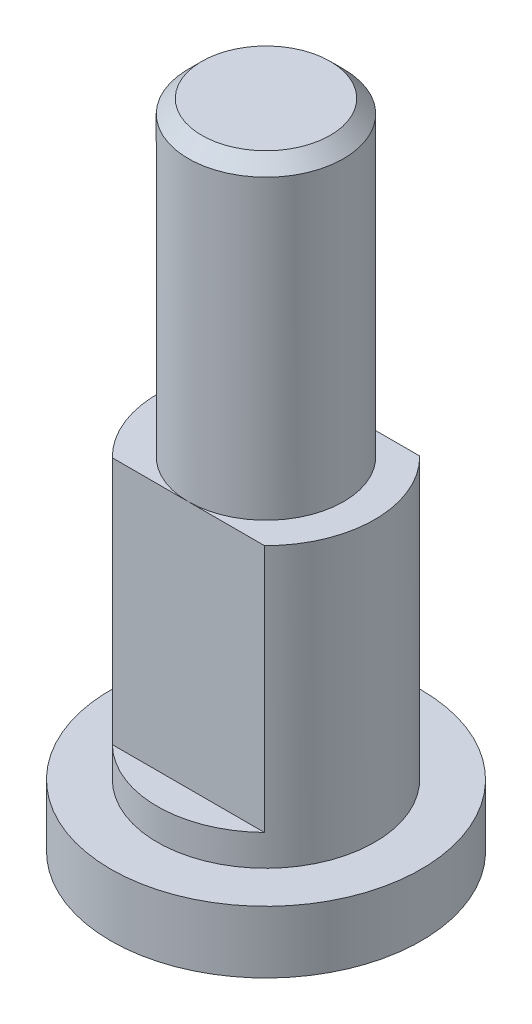
ISO-10303-21;
HEADER;
FILE_DESCRIPTION(('STEP AP214'),'2;1');
FILE_NAME('part.step','',(''),(''),'','','');
FILE_SCHEMA(('AUTOMOTIVE_DESIGN { 1 0 10303 214 1 1 1 1 }'));
ENDSEC;
DATA;
#1=APPLICATION_CONTEXT('core data for automotive mechanical design processes');
#2=APPLICATION_PROTOCOL_DEFINITION('international standard','automotive_design',2000,#1);
#3=PRODUCT_CONTEXT('',#1,'mechanical');
#4=PRODUCT('Part','Part','',(#3));
#5=PRODUCT_RELATED_PRODUCT_CATEGORY('part','',(#4));
#6=PRODUCT_DEFINITION_FORMATION('','',#4);
#7=PRODUCT_DEFINITION_CONTEXT('part definition',#1,'design');
#8=PRODUCT_DEFINITION('design','',#6,#7);
#9=PRODUCT_DEFINITION_SHAPE('','',#8);
#10=(LENGTH_UNIT() NAMED_UNIT(*) SI_UNIT(.MILLI.,.METRE.));
#11=(NAMED_UNIT(*) PLANE_ANGLE_UNIT() SI_UNIT($,.RADIAN.));
#12=(NAMED_UNIT(*) SI_UNIT($,.STERADIAN.) SOLID_ANGLE_UNIT());
#13=UNCERTAINTY_MEASURE_WITH_UNIT(LENGTH_MEASURE(1.E-05),#10,'distance_accuracy_value','');
#14=(GEOMETRIC_REPRESENTATION_CONTEXT(3) GLOBAL_UNCERTAINTY_ASSIGNED_CONTEXT((#13)) GLOBAL_UNIT_ASSIGNED_CONTEXT((#10,
#11,#12)) REPRESENTATION_CONTEXT('',''));
#15=CARTESIAN_POINT('',(0.,0.,0.));
#16=DIRECTION('',(0.,0.,1.));
#17=DIRECTION('',(1.,0.,0.));
#18=AXIS2_PLACEMENT_3D('',#15,#16,#17);
#19=CARTESIAN_POINT('',(0.,9.,0.));
#20=DIRECTION('',(0.,1.,0.));
#21=DIRECTION('',(0.,0.,1.));
#22=AXIS2_PLACEMENT_3D('',#19,#20,#21);
#23=PLANE('',#22);
#24=DIRECTION('',(1.,0.,0.));
#25=VECTOR('',#24,1.);
#26=CARTESIAN_POINT('',(0.,9.,-2.5));
#27=LINE('',#26,#25);
#28=CARTESIAN_POINT('',(5.,9.,-2.5));
#29=VERTEX_POINT('',#28);
#30=CARTESIAN_POINT('',(7.44948974278318,9.,-2.5));
#31=VERTEX_POINT('',#30);
#32=EDGE_CURVE('E102',#29,#31,#27,.T.);
#33=ORIENTED_EDGE('',*,*,#32,.F.);
#34=CARTESIAN_POINT('',(5.,9.,0.));
#35=DIRECTION('',(0.,-1.,0.));
#36=DIRECTION('',(0.,0.,-1.));
#37=AXIS2_PLACEMENT_3D('',#34,#35,#36);
#38=CIRCLE('',#37,2.5);
#39=CARTESIAN_POINT('',(5.,9.,2.5));
#40=VERTEX_POINT('',#39);
#41=EDGE_CURVE('E57',#29,#40,#38,.T.);
#42=ORIENTED_EDGE('',*,*,#41,.T.);
#43=DIRECTION('',(1.,0.,0.));
#44=VECTOR('',#43,1.);
#45=CARTESIAN_POINT('',(0.,9.,2.5));
#46=LINE('',#45,#44);
#47=CARTESIAN_POINT('',(7.44948974278318,9.,2.5));
#48=VERTEX_POINT('',#47);
#49=EDGE_CURVE('E100',#40,#48,#46,.T.);
#50=ORIENTED_EDGE('',*,*,#49,.T.);
#51=CARTESIAN_POINT('',(5.,9.,0.));
#52=DIRECTION('',(0.,-1.,0.));
#53=DIRECTION('',(0.,0.,-1.));
#54=AXIS2_PLACEMENT_3D('',#51,#52,#53);
#55=CIRCLE('',#54,3.5);
#56=EDGE_CURVE('E125',#31,#48,#55,.T.);
#57=ORIENTED_EDGE('',*,*,#56,.F.);
#58=EDGE_LOOP('',(#33,#42,#50,#57));
#59=FACE_BOUND('',#58,.T.);
#60=ADVANCED_FACE('F47',(#59),#23,.T.);
#61=CARTESIAN_POINT('',(5.,-2.,0.));
#62=DIRECTION('',(0.,-1.,0.));
#63=DIRECTION('',(0.,0.,-1.));
#64=AXIS2_PLACEMENT_3D('',#61,#62,#63);
#65=CYLINDRICAL_SURFACE('',#64,3.5);
#66=DIRECTION('',(0.,1.,0.));
#67=VECTOR('',#66,1.);
#68=CARTESIAN_POINT('',(2.55051025721682,0.999999999999999,-2.5));
#69=LINE('',#68,#67);
#70=CARTESIAN_POINT('',(2.55051025721682,0.999999999999999,-2.5));
#71=VERTEX_POINT('',#70);
#72=CARTESIAN_POINT('',(2.55051025721682,9.,-2.5));
#73=VERTEX_POINT('',#72);
#74=EDGE_CURVE('E69',#71,#73,#69,.T.);
#75=ORIENTED_EDGE('',*,*,#74,.F.);
#76=CARTESIAN_POINT('',(5.,0.999999999999999,0.));
#77=DIRECTION('',(0.,1.,0.));
#78=DIRECTION('',(0.,0.,1.));
#79=AXIS2_PLACEMENT_3D('',#76,#77,#78);
#80=CIRCLE('',#79,3.5);
#81=CARTESIAN_POINT('',(7.44948974278318,0.999999999999999,-2.5));
#82=VERTEX_POINT('',#81);
#83=EDGE_CURVE('E246',#82,#71,#80,.T.);
#84=ORIENTED_EDGE('',*,*,#83,.F.);
#85=DIRECTION('',(0.,1.,0.));
#86=VECTOR('',#85,1.);
#87=CARTESIAN_POINT('',(7.44948974278318,0.999999999999999,-2.5));
#88=LINE('',#87,#86);
#89=EDGE_CURVE('E245',#82,#31,#88,.T.);
#90=ORIENTED_EDGE('',*,*,#89,.T.);
#91=ORIENTED_EDGE('',*,*,#56,.T.);
#92=DIRECTION('',(0.,1.,0.));
#93=VECTOR('',#92,1.);
#94=CARTESIAN_POINT('',(7.44948974278318,0.999999999999999,2.5));
#95=LINE('',#94,#93);
#96=CARTESIAN_POINT('',(7.44948974278318,0.999999999999999,2.5));
#97=VERTEX_POINT('',#96);
#98=EDGE_CURVE('E109',#97,#48,#95,.T.);
#99=ORIENTED_EDGE('',*,*,#98,.F.);
#100=CARTESIAN_POINT('',(5.,0.999999999999999,0.));
#101=DIRECTION('',(0.,1.,0.));
#102=DIRECTION('',(0.,0.,1.));
#103=AXIS2_PLACEMENT_3D('',#100,#101,#102);
#104=CIRCLE('',#103,3.5);
#105=CARTESIAN_POINT('',(2.55051025721682,0.999999999999999,2.5));
#106=VERTEX_POINT('',#105);
#107=EDGE_CURVE('E118',#106,#97,#104,.T.);
#108=ORIENTED_EDGE('',*,*,#107,.F.);
#109=DIRECTION('',(0.,1.,0.));
#110=VECTOR('',#109,1.);
#111=CARTESIAN_POINT('',(2.55051025721682,0.999999999999999,2.5));
#112=LINE('',#111,#110);
#113=CARTESIAN_POINT('',(2.55051025721682,9.,2.5));
#114=VERTEX_POINT('',#113);
#115=EDGE_CURVE('E123',#106,#114,#112,.T.);
#116=ORIENTED_EDGE('',*,*,#115,.T.);
#117=EDGE_CURVE('E116',#114,#73,#55,.T.);
#118=ORIENTED_EDGE('',*,*,#117,.T.);
#119=EDGE_LOOP('',(#75,#84,#90,#91,#99,#108,#116,#118));
#120=FACE_BOUND('',#119,.T.);
#121=CARTESIAN_POINT('',(5.,0.,0.));
#122=DIRECTION('',(0.,-1.,0.));
#123=DIRECTION('',(0.,0.,-1.));
#124=AXIS2_PLACEMENT_3D('',#121,#122,#123);
#125=CIRCLE('',#124,3.5);
#126=CARTESIAN_POINT('',(5.,0.,-3.5));
#127=VERTEX_POINT('',#126);
#128=EDGE_CURVE('E127',#127,#127,#125,.T.);
#129=ORIENTED_EDGE('',*,*,#128,.F.);
#130=EDGE_LOOP('',(#129));
#131=FACE_BOUND('',#130,.T.);
#132=ADVANCED_FACE('F147',(#120,#131),#65,.T.);
#133=EDGE_CURVE('E106',#114,#40,#46,.T.);
#134=ORIENTED_EDGE('',*,*,#133,.T.);
#135=EDGE_CURVE('E11',#40,#29,#38,.T.);
#136=ORIENTED_EDGE('',*,*,#135,.T.);
#137=EDGE_CURVE('E252',#73,#29,#27,.T.);
#138=ORIENTED_EDGE('',*,*,#137,.F.);
#139=ORIENTED_EDGE('',*,*,#117,.F.);
#140=EDGE_LOOP('',(#134,#136,#138,#139));
#141=FACE_BOUND('',#140,.T.);
#142=ADVANCED_FACE('F114',(#141),#23,.T.);
#143=CARTESIAN_POINT('',(0.,-2.,0.));
#144=DIRECTION('',(0.,-1.,0.));
#145=DIRECTION('',(0.,0.,-1.));
#146=AXIS2_PLACEMENT_3D('',#143,#144,#145);
#147=PLANE('',#146);
#148=CARTESIAN_POINT('',(5.,-2.,0.));
#149=DIRECTION('',(0.,-1.,0.));
#150=DIRECTION('',(0.,0.,-1.));
#151=AXIS2_PLACEMENT_3D('',#148,#149,#150);
#152=CIRCLE('',#151,5.);
#153=CARTESIAN_POINT('',(5.,-2.,-5.));
#154=VERTEX_POINT('',#153);
#155=EDGE_CURVE('E51',#154,#154,#152,.T.);
#156=ORIENTED_EDGE('',*,*,#155,.T.);
#157=EDGE_LOOP('',(#156));
#158=FACE_BOUND('',#157,.T.);
#159=ADVANCED_FACE('F49',(#158),#147,.T.);
#160=CARTESIAN_POINT('',(5.,-2.,0.));
#161=DIRECTION('',(0.,-1.,0.));
#162=DIRECTION('',(0.,0.,-1.));
#163=AXIS2_PLACEMENT_3D('',#160,#161,#162);
#164=CYLINDRICAL_SURFACE('',#163,5.);
#165=ORIENTED_EDGE('',*,*,#155,.F.);
#166=EDGE_LOOP('',(#165));
#167=FACE_BOUND('',#166,.T.);
#168=CARTESIAN_POINT('',(5.,0.,0.));
#169=DIRECTION('',(0.,-1.,0.));
#170=DIRECTION('',(0.,0.,-1.));
#171=AXIS2_PLACEMENT_3D('',#168,#169,#170);
#172=CIRCLE('',#171,5.);
#173=CARTESIAN_POINT('',(5.,0.,-5.));
#174=VERTEX_POINT('',#173);
#175=EDGE_CURVE('E129',#174,#174,#172,.T.);
#176=ORIENTED_EDGE('',*,*,#175,.T.);
#177=EDGE_LOOP('',(#176));
#178=FACE_BOUND('',#177,.T.);
#179=ADVANCED_FACE('F137',(#167,#178),#164,.T.);
#180=CARTESIAN_POINT('',(0.,0.,0.));
#181=DIRECTION('',(0.,-1.,0.));
#182=DIRECTION('',(0.,0.,-1.));
#183=AXIS2_PLACEMENT_3D('',#180,#181,#182);
#184=PLANE('',#183);
#185=ORIENTED_EDGE('',*,*,#175,.F.);
#186=EDGE_LOOP('',(#185));
#187=FACE_BOUND('',#186,.T.);
#188=ORIENTED_EDGE('',*,*,#128,.T.);
#189=EDGE_LOOP('',(#188));
#190=FACE_BOUND('',#189,.T.);
#191=ADVANCED_FACE('F139',(#187,#190),#184,.F.);
#192=CARTESIAN_POINT('',(0.,0.999999999999999,2.5));
#193=DIRECTION('',(0.,0.,1.));
#194=DIRECTION('',(1.,0.,0.));
#195=AXIS2_PLACEMENT_3D('',#192,#193,#194);
#196=PLANE('',#195);
#197=ORIENTED_EDGE('',*,*,#133,.F.);
#198=ORIENTED_EDGE('',*,*,#115,.F.);
#199=DIRECTION('',(1.,0.,0.));
#200=VECTOR('',#199,1.);
#201=CARTESIAN_POINT('',(0.,0.999999999999999,2.5));
#202=LINE('',#201,#200);
#203=EDGE_CURVE('E117',#106,#97,#202,.T.);
#204=ORIENTED_EDGE('',*,*,#203,.T.);
#205=ORIENTED_EDGE('',*,*,#98,.T.);
#206=ORIENTED_EDGE('',*,*,#49,.F.);
#207=EDGE_LOOP('',(#197,#198,#204,#205,#206));
#208=FACE_BOUND('',#207,.T.);
#209=ADVANCED_FACE('F105',(#208),#196,.T.);
#210=CARTESIAN_POINT('',(0.,0.999999999999999,0.));
#211=DIRECTION('',(0.,1.,0.));
#212=DIRECTION('',(0.,0.,1.));
#213=AXIS2_PLACEMENT_3D('',#210,#211,#212);
#214=PLANE('',#213);
#215=ORIENTED_EDGE('',*,*,#203,.F.);
#216=ORIENTED_EDGE('',*,*,#107,.T.);
#217=EDGE_LOOP('',(#215,#216));
#218=FACE_BOUND('',#217,.T.);
#219=ADVANCED_FACE('F167',(#218),#214,.T.);
#220=CARTESIAN_POINT('',(0.,0.999999999999999,-2.5));
#221=DIRECTION('',(0.,0.,1.));
#222=DIRECTION('',(1.,0.,0.));
#223=AXIS2_PLACEMENT_3D('',#220,#221,#222);
#224=PLANE('',#223);
#225=ORIENTED_EDGE('',*,*,#137,.T.);
#226=ORIENTED_EDGE('',*,*,#32,.T.);
#227=ORIENTED_EDGE('',*,*,#89,.F.);
#228=DIRECTION('',(1.,0.,0.));
#229=VECTOR('',#228,1.);
#230=CARTESIAN_POINT('',(0.,0.999999999999999,-2.5));
#231=LINE('',#230,#229);
#232=EDGE_CURVE('E249',#71,#82,#231,.T.);
#233=ORIENTED_EDGE('',*,*,#232,.F.);
#234=ORIENTED_EDGE('',*,*,#74,.T.);
#235=EDGE_LOOP('',(#225,#226,#227,#233,#234));
#236=FACE_BOUND('',#235,.T.);
#237=ADVANCED_FACE('F171',(#236),#224,.F.);
#238=CARTESIAN_POINT('',(0.,0.999999999999999,0.));
#239=DIRECTION('',(0.,1.,0.));
#240=DIRECTION('',(0.,0.,1.));
#241=AXIS2_PLACEMENT_3D('',#238,#239,#240);
#242=PLANE('',#241);
#243=ORIENTED_EDGE('',*,*,#83,.T.);
#244=ORIENTED_EDGE('',*,*,#232,.T.);
#245=EDGE_LOOP('',(#243,#244));
#246=FACE_BOUND('',#245,.T.);
#247=ADVANCED_FACE('F175',(#246),#242,.T.);
#248=CARTESIAN_POINT('',(7.067,19.,0.));
#249=DIRECTION('',(0.,1.,0.));
#250=DIRECTION('',(0.,0.,1.));
#251=AXIS2_PLACEMENT_3D('',#248,#249,#250);
#252=PLANE('',#251);
#253=CARTESIAN_POINT('',(5.,19.,0.));
#254=DIRECTION('',(0.,-1.,0.));
#255=DIRECTION('',(0.,0.,-1.));
#256=AXIS2_PLACEMENT_3D('',#253,#254,#255);
#257=CIRCLE('',#256,2.067);
#258=CARTESIAN_POINT('',(5.,19.,-2.067));
#259=VERTEX_POINT('',#258);
#260=EDGE_CURVE('E111',#259,#259,#257,.T.);
#261=ORIENTED_EDGE('',*,*,#260,.F.);
#262=EDGE_LOOP('',(#261));
#263=FACE_BOUND('',#262,.T.);
#264=ADVANCED_FACE('F180',(#263),#252,.T.);
#265=CARTESIAN_POINT('',(5.,18.567,0.));
#266=DIRECTION('',(0.,-1.,0.));
#267=DIRECTION('',(0.,0.,-1.));
#268=AXIS2_PLACEMENT_3D('',#265,#266,#267);
#269=CONICAL_SURFACE('',#268,2.5,0.785398163397447);
#270=ORIENTED_EDGE('',*,*,#260,.T.);
#271=EDGE_LOOP('',(#270));
#272=FACE_BOUND('',#271,.T.);
#273=CARTESIAN_POINT('',(5.,18.567,0.));
#274=DIRECTION('',(0.,-1.,0.));
#275=DIRECTION('',(0.,0.,-1.));
#276=AXIS2_PLACEMENT_3D('',#273,#274,#275);
#277=CIRCLE('',#276,2.5);
#278=CARTESIAN_POINT('',(5.,18.567,-2.5));
#279=VERTEX_POINT('',#278);
#280=EDGE_CURVE('E103',#279,#279,#277,.T.);
#281=ORIENTED_EDGE('',*,*,#280,.F.);
#282=EDGE_LOOP('',(#281));
#283=FACE_BOUND('',#282,.T.);
#284=ADVANCED_FACE('F184',(#272,#283),#269,.T.);
#285=CARTESIAN_POINT('',(5.,9.,0.));
#286=DIRECTION('',(0.,-1.,0.));
#287=DIRECTION('',(0.,0.,-1.));
#288=AXIS2_PLACEMENT_3D('',#285,#286,#287);
#289=CYLINDRICAL_SURFACE('',#288,2.5);
#290=ORIENTED_EDGE('',*,*,#280,.T.);
#291=EDGE_LOOP('',(#290));
#292=FACE_BOUND('',#291,.T.);
#293=ORIENTED_EDGE('',*,*,#41,.F.);
#294=ORIENTED_EDGE('',*,*,#135,.F.);
#295=EDGE_LOOP('',(#293,#294));
#296=FACE_BOUND('',#295,.T.);
#297=ADVANCED_FACE('F93',(#292,#296),#289,.T.);
#298=CLOSED_SHELL('',(#60,#132,#142,#159,#179,#191,#209,#219,#237,#247,#264,#284,#297));
#299=MANIFOLD_SOLID_BREP('B2',#298);
#300=ADVANCED_BREP_SHAPE_REPRESENTATION('',(#18,#299),#14);
#301=SHAPE_DEFINITION_REPRESENTATION(#9,#300);
ENDSEC;
END-ISO-10303-21;
